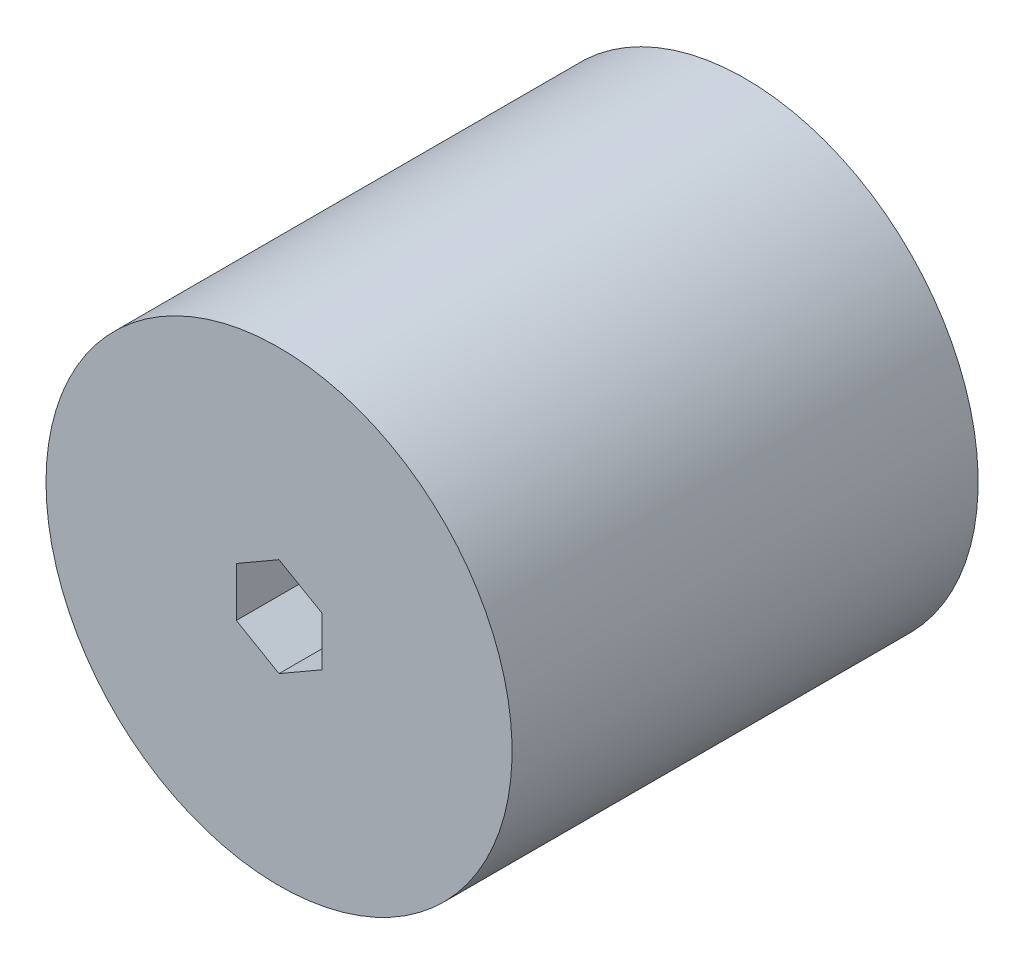
ISO-10303-21;
HEADER;
FILE_DESCRIPTION(('STEP AP214'),'2;1');
FILE_NAME('part.step','',(''),(''),'','','');
FILE_SCHEMA(('AUTOMOTIVE_DESIGN { 1 0 10303 214 1 1 1 1 }'));
ENDSEC;
DATA;
#1=APPLICATION_CONTEXT('core data for automotive mechanical design processes');
#2=APPLICATION_PROTOCOL_DEFINITION('international standard','automotive_design',2000,#1);
#3=PRODUCT_CONTEXT('',#1,'mechanical');
#4=PRODUCT('Part','Part','',(#3));
#5=PRODUCT_RELATED_PRODUCT_CATEGORY('part','',(#4));
#6=PRODUCT_DEFINITION_FORMATION('','',#4);
#7=PRODUCT_DEFINITION_CONTEXT('part definition',#1,'design');
#8=PRODUCT_DEFINITION('design','',#6,#7);
#9=PRODUCT_DEFINITION_SHAPE('','',#8);
#10=(LENGTH_UNIT() NAMED_UNIT(*) SI_UNIT(.MILLI.,.METRE.));
#11=(NAMED_UNIT(*) PLANE_ANGLE_UNIT() SI_UNIT($,.RADIAN.));
#12=(NAMED_UNIT(*) SI_UNIT($,.STERADIAN.) SOLID_ANGLE_UNIT());
#13=UNCERTAINTY_MEASURE_WITH_UNIT(LENGTH_MEASURE(1.E-05),#10,'distance_accuracy_value','');
#14=(GEOMETRIC_REPRESENTATION_CONTEXT(3) GLOBAL_UNCERTAINTY_ASSIGNED_CONTEXT((#13)) GLOBAL_UNIT_ASSIGNED_CONTEXT((#10,
#11,#12)) REPRESENTATION_CONTEXT('',''));
#15=CARTESIAN_POINT('',(0.,0.,0.));
#16=DIRECTION('',(0.,0.,1.));
#17=DIRECTION('',(1.,0.,0.));
#18=AXIS2_PLACEMENT_3D('',#15,#16,#17);
#19=CARTESIAN_POINT('',(0.,0.,76.2));
#20=DIRECTION('',(0.,0.,1.));
#21=DIRECTION('',(1.,0.,0.));
#22=AXIS2_PLACEMENT_3D('',#19,#20,#21);
#23=PLANE('',#22);
#24=CARTESIAN_POINT('',(0.,0.,76.2));
#25=DIRECTION('',(0.,0.,1.));
#26=DIRECTION('',(1.,0.,0.));
#27=AXIS2_PLACEMENT_3D('',#24,#25,#26);
#28=CIRCLE('',#27,38.1);
#29=CARTESIAN_POINT('',(-38.1,0.,76.2));
#30=VERTEX_POINT('',#29);
#31=EDGE_CURVE('E11',#30,#30,#28,.T.);
#32=ORIENTED_EDGE('',*,*,#31,.T.);
#33=EDGE_LOOP('',(#32));
#34=FACE_BOUND('',#33,.T.);
#35=DIRECTION('',(-0.866025403784439,-0.5,0.));
#36=VECTOR('',#35,1.);
#37=CARTESIAN_POINT('',(0.,8.06558326057907,76.2));
#38=LINE('',#37,#36);
#39=CARTESIAN_POINT('',(0.,8.06558326057907,76.2));
#40=VERTEX_POINT('',#39);
#41=CARTESIAN_POINT('',(-6.985,4.03279163028954,76.2));
#42=VERTEX_POINT('',#41);
#43=EDGE_CURVE('E97',#40,#42,#38,.T.);
#44=ORIENTED_EDGE('',*,*,#43,.F.);
#45=DIRECTION('',(-0.866025403784439,0.5,0.));
#46=VECTOR('',#45,1.);
#47=CARTESIAN_POINT('',(6.985,4.03279163028954,76.2));
#48=LINE('',#47,#46);
#49=CARTESIAN_POINT('',(6.985,4.03279163028954,76.2));
#50=VERTEX_POINT('',#49);
#51=EDGE_CURVE('E89',#50,#40,#48,.T.);
#52=ORIENTED_EDGE('',*,*,#51,.F.);
#53=DIRECTION('',(0.,1.,0.));
#54=VECTOR('',#53,1.);
#55=CARTESIAN_POINT('',(6.985,-4.03279163028954,76.2));
#56=LINE('',#55,#54);
#57=CARTESIAN_POINT('',(6.985,-4.03279163028954,76.2));
#58=VERTEX_POINT('',#57);
#59=EDGE_CURVE('E117',#58,#50,#56,.T.);
#60=ORIENTED_EDGE('',*,*,#59,.F.);
#61=DIRECTION('',(0.866025403784439,0.5,0.));
#62=VECTOR('',#61,1.);
#63=CARTESIAN_POINT('',(0.,-8.06558326057907,76.2));
#64=LINE('',#63,#62);
#65=CARTESIAN_POINT('',(0.,-8.06558326057907,76.2));
#66=VERTEX_POINT('',#65);
#67=EDGE_CURVE('E115',#66,#58,#64,.T.);
#68=ORIENTED_EDGE('',*,*,#67,.F.);
#69=DIRECTION('',(0.866025403784439,-0.5,0.));
#70=VECTOR('',#69,1.);
#71=CARTESIAN_POINT('',(-6.985,-4.03279163028954,76.2));
#72=LINE('',#71,#70);
#73=CARTESIAN_POINT('',(-6.985,-4.03279163028954,76.2));
#74=VERTEX_POINT('',#73);
#75=EDGE_CURVE('E111',#74,#66,#72,.T.);
#76=ORIENTED_EDGE('',*,*,#75,.F.);
#77=DIRECTION('',(0.,-1.,0.));
#78=VECTOR('',#77,1.);
#79=CARTESIAN_POINT('',(-6.985,4.03279163028954,76.2));
#80=LINE('',#79,#78);
#81=EDGE_CURVE('E109',#42,#74,#80,.T.);
#82=ORIENTED_EDGE('',*,*,#81,.F.);
#83=EDGE_LOOP('',(#44,#52,#60,#68,#76,#82));
#84=FACE_BOUND('',#83,.T.);
#85=ADVANCED_FACE('F36',(#34,#84),#23,.T.);
#86=CARTESIAN_POINT('',(0.,0.,0.));
#87=DIRECTION('',(0.,0.,1.));
#88=DIRECTION('',(1.,0.,0.));
#89=AXIS2_PLACEMENT_3D('',#86,#87,#88);
#90=PLANE('',#89);
#91=CARTESIAN_POINT('',(0.,0.,0.));
#92=DIRECTION('',(0.,0.,1.));
#93=DIRECTION('',(1.,0.,0.));
#94=AXIS2_PLACEMENT_3D('',#91,#92,#93);
#95=CIRCLE('',#94,38.1);
#96=CARTESIAN_POINT('',(-38.1,0.,0.));
#97=VERTEX_POINT('',#96);
#98=EDGE_CURVE('E40',#97,#97,#95,.T.);
#99=ORIENTED_EDGE('',*,*,#98,.F.);
#100=EDGE_LOOP('',(#99));
#101=FACE_BOUND('',#100,.T.);
#102=DIRECTION('',(-0.866025403784439,0.5,0.));
#103=VECTOR('',#102,1.);
#104=CARTESIAN_POINT('',(6.985,4.03279163028954,0.));
#105=LINE('',#104,#103);
#106=CARTESIAN_POINT('',(6.985,4.03279163028954,0.));
#107=VERTEX_POINT('',#106);
#108=CARTESIAN_POINT('',(0.,8.06558326057907,0.));
#109=VERTEX_POINT('',#108);
#110=EDGE_CURVE('E59',#107,#109,#105,.T.);
#111=ORIENTED_EDGE('',*,*,#110,.T.);
#112=DIRECTION('',(-0.866025403784439,-0.5,0.));
#113=VECTOR('',#112,1.);
#114=CARTESIAN_POINT('',(0.,8.06558326057907,0.));
#115=LINE('',#114,#113);
#116=CARTESIAN_POINT('',(-6.985,4.03279163028954,0.));
#117=VERTEX_POINT('',#116);
#118=EDGE_CURVE('E104',#109,#117,#115,.T.);
#119=ORIENTED_EDGE('',*,*,#118,.T.);
#120=DIRECTION('',(0.,-1.,0.));
#121=VECTOR('',#120,1.);
#122=CARTESIAN_POINT('',(-6.985,4.03279163028954,0.));
#123=LINE('',#122,#121);
#124=CARTESIAN_POINT('',(-6.985,-4.03279163028954,0.));
#125=VERTEX_POINT('',#124);
#126=EDGE_CURVE('E121',#117,#125,#123,.T.);
#127=ORIENTED_EDGE('',*,*,#126,.T.);
#128=DIRECTION('',(0.866025403784439,-0.5,0.));
#129=VECTOR('',#128,1.);
#130=CARTESIAN_POINT('',(-6.985,-4.03279163028954,0.));
#131=LINE('',#130,#129);
#132=CARTESIAN_POINT('',(0.,-8.06558326057907,0.));
#133=VERTEX_POINT('',#132);
#134=EDGE_CURVE('E124',#125,#133,#131,.T.);
#135=ORIENTED_EDGE('',*,*,#134,.T.);
#136=DIRECTION('',(0.866025403784439,0.5,0.));
#137=VECTOR('',#136,1.);
#138=CARTESIAN_POINT('',(0.,-8.06558326057907,0.));
#139=LINE('',#138,#137);
#140=CARTESIAN_POINT('',(6.985,-4.03279163028954,0.));
#141=VERTEX_POINT('',#140);
#142=EDGE_CURVE('E127',#133,#141,#139,.T.);
#143=ORIENTED_EDGE('',*,*,#142,.T.);
#144=DIRECTION('',(0.,1.,0.));
#145=VECTOR('',#144,1.);
#146=CARTESIAN_POINT('',(6.985,-4.03279163028954,0.));
#147=LINE('',#146,#145);
#148=EDGE_CURVE('E98',#141,#107,#147,.T.);
#149=ORIENTED_EDGE('',*,*,#148,.T.);
#150=EDGE_LOOP('',(#111,#119,#127,#135,#143,#149));
#151=FACE_BOUND('',#150,.T.);
#152=ADVANCED_FACE('F144',(#101,#151),#90,.F.);
#153=CARTESIAN_POINT('',(0.,0.,76.2));
#154=DIRECTION('',(0.,0.,-1.));
#155=DIRECTION('',(-1.,0.,0.));
#156=AXIS2_PLACEMENT_3D('',#153,#154,#155);
#157=CYLINDRICAL_SURFACE('',#156,38.1);
#158=CARTESIAN_POINT('',(-38.1,0.,76.2));
#159=CARTESIAN_POINT('',(-38.1,0.,75.40625));
#160=CARTESIAN_POINT('',(-38.1,0.,74.6125));
#161=CARTESIAN_POINT('',(-38.1,0.,73.025));
#162=CARTESIAN_POINT('',(-38.1,0.,72.23125));
#163=CARTESIAN_POINT('',(-38.1,0.,70.64375));
#164=CARTESIAN_POINT('',(-38.1,0.,69.85));
#165=CARTESIAN_POINT('',(-38.1,0.,68.2625));
#166=CARTESIAN_POINT('',(-38.1,0.,67.46875));
#167=CARTESIAN_POINT('',(-38.1,0.,65.88125));
#168=CARTESIAN_POINT('',(-38.1,0.,65.0875));
#169=CARTESIAN_POINT('',(-38.1,0.,63.5));
#170=CARTESIAN_POINT('',(-38.1,0.,62.70625));
#171=CARTESIAN_POINT('',(-38.1,0.,61.11875));
#172=CARTESIAN_POINT('',(-38.1,0.,60.325));
#173=CARTESIAN_POINT('',(-38.1,0.,58.7375));
#174=CARTESIAN_POINT('',(-38.1,0.,57.94375));
#175=CARTESIAN_POINT('',(-38.1,0.,56.35625));
#176=CARTESIAN_POINT('',(-38.1,0.,55.5625));
#177=CARTESIAN_POINT('',(-38.1,0.,53.975));
#178=CARTESIAN_POINT('',(-38.1,0.,53.18125));
#179=CARTESIAN_POINT('',(-38.1,0.,51.59375));
#180=CARTESIAN_POINT('',(-38.1,0.,50.8));
#181=CARTESIAN_POINT('',(-38.1,0.,49.2125));
#182=CARTESIAN_POINT('',(-38.1,0.,48.41875));
#183=CARTESIAN_POINT('',(-38.1,0.,46.83125));
#184=CARTESIAN_POINT('',(-38.1,0.,46.0375));
#185=CARTESIAN_POINT('',(-38.1,0.,44.45));
#186=CARTESIAN_POINT('',(-38.1,0.,43.65625));
#187=CARTESIAN_POINT('',(-38.1,0.,42.06875));
#188=CARTESIAN_POINT('',(-38.1,0.,41.275));
#189=CARTESIAN_POINT('',(-38.1,0.,39.6875));
#190=CARTESIAN_POINT('',(-38.1,0.,38.89375));
#191=CARTESIAN_POINT('',(-38.1,0.,37.30625));
#192=CARTESIAN_POINT('',(-38.1,0.,36.5125));
#193=CARTESIAN_POINT('',(-38.1,0.,34.925));
#194=CARTESIAN_POINT('',(-38.1,0.,34.13125));
#195=CARTESIAN_POINT('',(-38.1,0.,32.54375));
#196=CARTESIAN_POINT('',(-38.1,0.,31.75));
#197=CARTESIAN_POINT('',(-38.1,0.,30.1625));
#198=CARTESIAN_POINT('',(-38.1,0.,29.36875));
#199=CARTESIAN_POINT('',(-38.1,0.,27.78125));
#200=CARTESIAN_POINT('',(-38.1,0.,26.9875));
#201=CARTESIAN_POINT('',(-38.1,0.,25.4));
#202=CARTESIAN_POINT('',(-38.1,0.,24.60625));
#203=CARTESIAN_POINT('',(-38.1,0.,23.01875));
#204=CARTESIAN_POINT('',(-38.1,0.,22.225));
#205=CARTESIAN_POINT('',(-38.1,0.,20.6375));
#206=CARTESIAN_POINT('',(-38.1,0.,19.84375));
#207=CARTESIAN_POINT('',(-38.1,0.,18.25625));
#208=CARTESIAN_POINT('',(-38.1,0.,17.4625));
#209=CARTESIAN_POINT('',(-38.1,0.,15.875));
#210=CARTESIAN_POINT('',(-38.1,0.,15.08125));
#211=CARTESIAN_POINT('',(-38.1,0.,13.49375));
#212=CARTESIAN_POINT('',(-38.1,0.,12.7));
#213=CARTESIAN_POINT('',(-38.1,0.,11.1125));
#214=CARTESIAN_POINT('',(-38.1,0.,10.31875));
#215=CARTESIAN_POINT('',(-38.1,0.,8.73125));
#216=CARTESIAN_POINT('',(-38.1,0.,7.93750000000001));
#217=CARTESIAN_POINT('',(-38.1,0.,6.35));
#218=CARTESIAN_POINT('',(-38.1,0.,5.55625));
#219=CARTESIAN_POINT('',(-38.1,0.,3.96875));
#220=CARTESIAN_POINT('',(-38.1,0.,3.175));
#221=CARTESIAN_POINT('',(-38.1,0.,1.5875));
#222=CARTESIAN_POINT('',(-38.1,0.,0.793750000000001));
#223=CARTESIAN_POINT('',(-38.1,0.,0.));
#224=B_SPLINE_CURVE_WITH_KNOTS('',3,(#158,#159,#160,#161,#162,#163,#164,#165,#166,#167,#168,
#169,#170,#171,#172,#173,#174,#175,#176,#177,#178,#179,#180,#181,#182,#183,#184,#185,#186,#187,
#188,#189,#190,#191,#192,#193,#194,#195,#196,#197,#198,#199,#200,#201,#202,#203,#204,#205,#206,
#207,#208,#209,#210,#211,#212,#213,#214,#215,#216,#217,#218,#219,#220,#221,#222,#223),
.UNSPECIFIED.,.F.,.F.,(4,2,2,2,2,2,2,2,2,2,2,2,2,2,2,2,2,2,2,2,2,2,2,2,2,2,2,2,2,2,2,2,4),(0.,
2.38125,4.7625,7.14375,9.52500000000001,11.90625,14.2875,16.66875,19.05,21.43125,23.8125,
26.19375,28.575,30.95625,33.3375,35.71875,38.1,40.48125,42.8625,45.24375,47.625,50.00625,
52.3875,54.76875,57.15,59.53125,61.9125,64.29375,66.675,69.05625,71.4375,73.81875,76.2),.UNSPECIFIED.);
#225=EDGE_CURVE('BSEAM38',#30,#97,#224,.T.);
#226=ORIENTED_EDGE('',*,*,#31,.F.);
#227=ORIENTED_EDGE('',*,*,#98,.T.);
#228=ORIENTED_EDGE('',*,*,#225,.T.);
#229=ORIENTED_EDGE('',*,*,#225,.F.);
#230=EDGE_LOOP('',(#226,#228,#227,#229));
#231=FACE_BOUND('',#230,.T.);
#232=ADVANCED_FACE('F38',(#231),#157,.T.);
#233=CARTESIAN_POINT('',(6.985,4.03279163028954,76.2));
#234=DIRECTION('',(-0.5,-0.866025403784439,0.));
#235=DIRECTION('',(0.866025403784439,-0.5,0.));
#236=AXIS2_PLACEMENT_3D('',#233,#234,#235);
#237=PLANE('',#236);
#238=ORIENTED_EDGE('',*,*,#110,.F.);
#239=DIRECTION('',(0.,0.,-1.));
#240=VECTOR('',#239,1.);
#241=CARTESIAN_POINT('',(6.985,4.03279163028954,76.2));
#242=LINE('',#241,#240);
#243=EDGE_CURVE('E93',#50,#107,#242,.T.);
#244=ORIENTED_EDGE('',*,*,#243,.F.);
#245=ORIENTED_EDGE('',*,*,#51,.T.);
#246=DIRECTION('',(0.,0.,-1.));
#247=VECTOR('',#246,1.);
#248=CARTESIAN_POINT('',(0.,8.06558326057907,76.2));
#249=LINE('',#248,#247);
#250=EDGE_CURVE('E92',#40,#109,#249,.T.);
#251=ORIENTED_EDGE('',*,*,#250,.T.);
#252=EDGE_LOOP('',(#238,#244,#245,#251));
#253=FACE_BOUND('',#252,.T.);
#254=ADVANCED_FACE('F91',(#253),#237,.T.);
#255=CARTESIAN_POINT('',(0.,8.06558326057907,76.2));
#256=DIRECTION('',(0.5,-0.866025403784439,0.));
#257=DIRECTION('',(0.866025403784439,0.5,0.));
#258=AXIS2_PLACEMENT_3D('',#255,#256,#257);
#259=PLANE('',#258);
#260=ORIENTED_EDGE('',*,*,#118,.F.);
#261=ORIENTED_EDGE('',*,*,#250,.F.);
#262=ORIENTED_EDGE('',*,*,#43,.T.);
#263=DIRECTION('',(0.,0.,-1.));
#264=VECTOR('',#263,1.);
#265=CARTESIAN_POINT('',(-6.985,4.03279163028954,76.2));
#266=LINE('',#265,#264);
#267=EDGE_CURVE('E105',#42,#117,#266,.T.);
#268=ORIENTED_EDGE('',*,*,#267,.T.);
#269=EDGE_LOOP('',(#260,#261,#262,#268));
#270=FACE_BOUND('',#269,.T.);
#271=ADVANCED_FACE('F101',(#270),#259,.T.);
#272=CARTESIAN_POINT('',(-6.985,4.03279163028954,76.2));
#273=DIRECTION('',(1.,0.,0.));
#274=DIRECTION('',(0.,1.,0.));
#275=AXIS2_PLACEMENT_3D('',#272,#273,#274);
#276=PLANE('',#275);
#277=ORIENTED_EDGE('',*,*,#126,.F.);
#278=ORIENTED_EDGE('',*,*,#267,.F.);
#279=ORIENTED_EDGE('',*,*,#81,.T.);
#280=DIRECTION('',(0.,0.,-1.));
#281=VECTOR('',#280,1.);
#282=CARTESIAN_POINT('',(-6.985,-4.03279163028954,76.2));
#283=LINE('',#282,#281);
#284=EDGE_CURVE('E136',#74,#125,#283,.T.);
#285=ORIENTED_EDGE('',*,*,#284,.T.);
#286=EDGE_LOOP('',(#277,#278,#279,#285));
#287=FACE_BOUND('',#286,.T.);
#288=ADVANCED_FACE('F140',(#287),#276,.T.);
#289=CARTESIAN_POINT('',(-6.985,-4.03279163028954,76.2));
#290=DIRECTION('',(0.5,0.866025403784439,0.));
#291=DIRECTION('',(-0.866025403784439,0.5,0.));
#292=AXIS2_PLACEMENT_3D('',#289,#290,#291);
#293=PLANE('',#292);
#294=ORIENTED_EDGE('',*,*,#134,.F.);
#295=ORIENTED_EDGE('',*,*,#284,.F.);
#296=ORIENTED_EDGE('',*,*,#75,.T.);
#297=DIRECTION('',(0.,0.,-1.));
#298=VECTOR('',#297,1.);
#299=CARTESIAN_POINT('',(0.,-8.06558326057907,76.2));
#300=LINE('',#299,#298);
#301=EDGE_CURVE('E134',#66,#133,#300,.T.);
#302=ORIENTED_EDGE('',*,*,#301,.T.);
#303=EDGE_LOOP('',(#294,#295,#296,#302));
#304=FACE_BOUND('',#303,.T.);
#305=ADVANCED_FACE('F152',(#304),#293,.T.);
#306=CARTESIAN_POINT('',(0.,-8.06558326057907,76.2));
#307=DIRECTION('',(-0.5,0.866025403784439,0.));
#308=DIRECTION('',(-0.866025403784439,-0.5,0.));
#309=AXIS2_PLACEMENT_3D('',#306,#307,#308);
#310=PLANE('',#309);
#311=ORIENTED_EDGE('',*,*,#142,.F.);
#312=ORIENTED_EDGE('',*,*,#301,.F.);
#313=ORIENTED_EDGE('',*,*,#67,.T.);
#314=DIRECTION('',(0.,0.,-1.));
#315=VECTOR('',#314,1.);
#316=CARTESIAN_POINT('',(6.985,-4.03279163028954,76.2));
#317=LINE('',#316,#315);
#318=EDGE_CURVE('E51',#58,#141,#317,.T.);
#319=ORIENTED_EDGE('',*,*,#318,.T.);
#320=EDGE_LOOP('',(#311,#312,#313,#319));
#321=FACE_BOUND('',#320,.T.);
#322=ADVANCED_FACE('F150',(#321),#310,.T.);
#323=CARTESIAN_POINT('',(6.985,-4.03279163028954,76.2));
#324=DIRECTION('',(-1.,0.,0.));
#325=DIRECTION('',(0.,-1.,0.));
#326=AXIS2_PLACEMENT_3D('',#323,#324,#325);
#327=PLANE('',#326);
#328=ORIENTED_EDGE('',*,*,#148,.F.);
#329=ORIENTED_EDGE('',*,*,#318,.F.);
#330=ORIENTED_EDGE('',*,*,#59,.T.);
#331=ORIENTED_EDGE('',*,*,#243,.T.);
#332=EDGE_LOOP('',(#328,#329,#330,#331));
#333=FACE_BOUND('',#332,.T.);
#334=ADVANCED_FACE('F146',(#333),#327,.T.);
#335=CLOSED_SHELL('',(#85,#152,#232,#254,#271,#288,#305,#322,#334));
#336=MANIFOLD_SOLID_BREP('B2',#335);
#337=ADVANCED_BREP_SHAPE_REPRESENTATION('',(#18,#336),#14);
#338=SHAPE_DEFINITION_REPRESENTATION(#9,#337);
ENDSEC;
END-ISO-10303-21;
